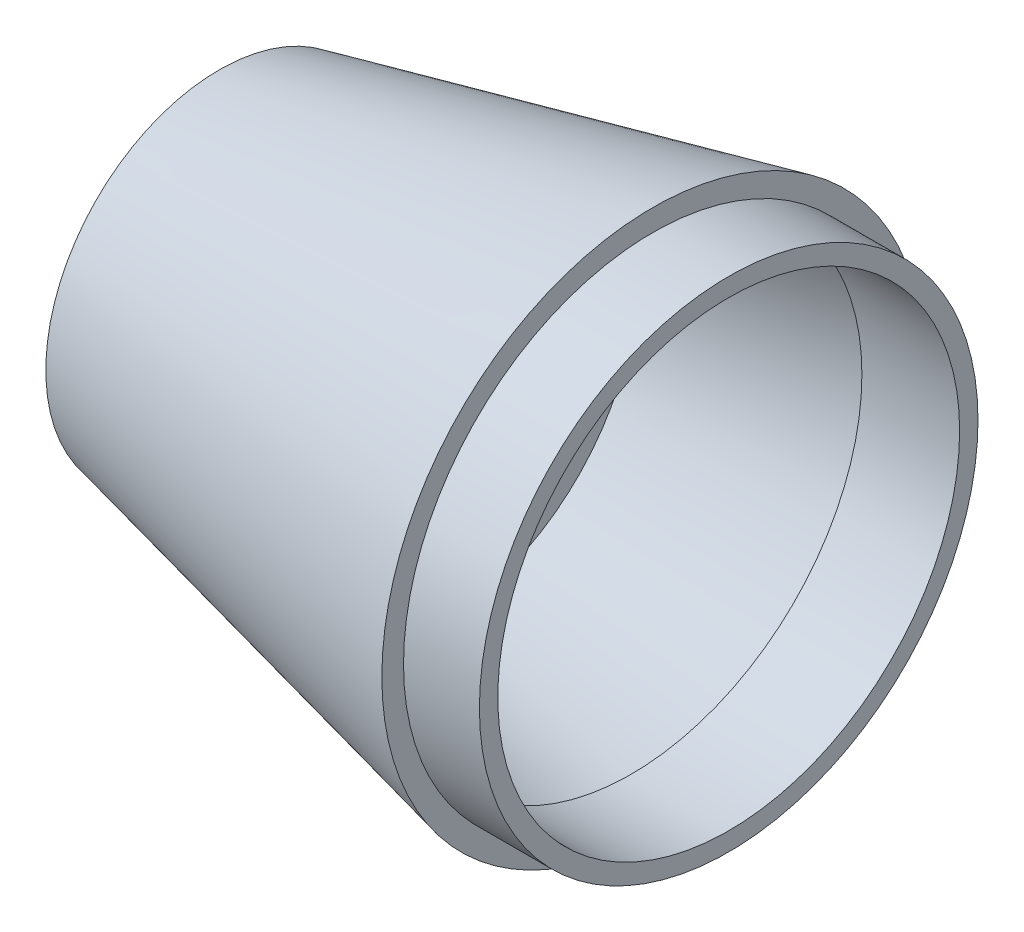
ISO-10303-21;
HEADER;
FILE_DESCRIPTION(('STEP AP214'),'2;1');
FILE_NAME('part.step','',(''),(''),'','','');
FILE_SCHEMA(('AUTOMOTIVE_DESIGN { 1 0 10303 214 1 1 1 1 }'));
ENDSEC;
DATA;
#1=APPLICATION_CONTEXT('core data for automotive mechanical design processes');
#2=APPLICATION_PROTOCOL_DEFINITION('international standard','automotive_design',2000,#1);
#3=PRODUCT_CONTEXT('',#1,'mechanical');
#4=PRODUCT('Part','Part','',(#3));
#5=PRODUCT_RELATED_PRODUCT_CATEGORY('part','',(#4));
#6=PRODUCT_DEFINITION_FORMATION('','',#4);
#7=PRODUCT_DEFINITION_CONTEXT('part definition',#1,'design');
#8=PRODUCT_DEFINITION('design','',#6,#7);
#9=PRODUCT_DEFINITION_SHAPE('','',#8);
#10=(LENGTH_UNIT() NAMED_UNIT(*) SI_UNIT(.MILLI.,.METRE.));
#11=(NAMED_UNIT(*) PLANE_ANGLE_UNIT() SI_UNIT($,.RADIAN.));
#12=(NAMED_UNIT(*) SI_UNIT($,.STERADIAN.) SOLID_ANGLE_UNIT());
#13=UNCERTAINTY_MEASURE_WITH_UNIT(LENGTH_MEASURE(1.E-05),#10,'distance_accuracy_value','');
#14=(GEOMETRIC_REPRESENTATION_CONTEXT(3) GLOBAL_UNCERTAINTY_ASSIGNED_CONTEXT((#13)) GLOBAL_UNIT_ASSIGNED_CONTEXT((#10,
#11,#12)) REPRESENTATION_CONTEXT('',''));
#15=CARTESIAN_POINT('',(0.,0.,0.));
#16=DIRECTION('',(0.,0.,1.));
#17=DIRECTION('',(1.,0.,0.));
#18=AXIS2_PLACEMENT_3D('',#15,#16,#17);
#19=CARTESIAN_POINT('',(-12.065,0.,0.));
#20=DIRECTION('',(-1.,0.,0.));
#21=DIRECTION('',(0.,0.,1.));
#22=AXIS2_PLACEMENT_3D('',#19,#20,#21);
#23=PLANE('',#22);
#24=CARTESIAN_POINT('',(-12.065,0.,0.));
#25=DIRECTION('',(1.,0.,0.));
#26=DIRECTION('',(0.,0.,-1.));
#27=AXIS2_PLACEMENT_3D('',#24,#25,#26);
#28=CIRCLE('',#27,8.88999999999999);
#29=CARTESIAN_POINT('',(-12.065,0.,-8.88999999999999));
#30=VERTEX_POINT('',#29);
#31=EDGE_CURVE('E10',#30,#30,#28,.T.);
#32=ORIENTED_EDGE('',*,*,#31,.T.);
#33=EDGE_LOOP('',(#32));
#34=FACE_BOUND('',#33,.T.);
#35=CARTESIAN_POINT('',(-12.065,0.,0.));
#36=DIRECTION('',(1.,0.,0.));
#37=DIRECTION('',(0.,0.,-1.));
#38=AXIS2_PLACEMENT_3D('',#35,#36,#37);
#39=CIRCLE('',#38,10.16);
#40=CARTESIAN_POINT('',(-12.065,0.,-10.16));
#41=VERTEX_POINT('',#40);
#42=EDGE_CURVE('E60',#41,#41,#39,.T.);
#43=ORIENTED_EDGE('',*,*,#42,.F.);
#44=EDGE_LOOP('',(#43));
#45=FACE_BOUND('',#44,.T.);
#46=ADVANCED_FACE('F45',(#34,#45),#23,.T.);
#47=CARTESIAN_POINT('',(-12.065,0.,0.));
#48=DIRECTION('',(1.,0.,0.));
#49=DIRECTION('',(0.,0.,-1.));
#50=AXIS2_PLACEMENT_3D('',#47,#48,#49);
#51=CONICAL_SURFACE('',#50,8.88999999999999,0.221314442347792);
#52=CARTESIAN_POINT('',(-0.848332369137096,0.,0.));
#53=DIRECTION('',(1.,0.,0.));
#54=DIRECTION('',(0.,0.,-1.));
#55=AXIS2_PLACEMENT_3D('',#52,#53,#54);
#56=CIRCLE('',#55,11.4137502169441);
#57=CARTESIAN_POINT('',(-0.848332369137096,0.,-11.4137502169441));
#58=VERTEX_POINT('',#57);
#59=EDGE_CURVE('E54',#58,#58,#56,.T.);
#60=ORIENTED_EDGE('',*,*,#59,.T.);
#61=EDGE_LOOP('',(#60));
#62=FACE_BOUND('',#61,.T.);
#63=ORIENTED_EDGE('',*,*,#31,.F.);
#64=EDGE_LOOP('',(#63));
#65=FACE_BOUND('',#64,.T.);
#66=ADVANCED_FACE('F110',(#62,#65),#51,.F.);
#67=CARTESIAN_POINT('',(-0.848332369137096,0.,0.));
#68=DIRECTION('',(1.,0.,0.));
#69=DIRECTION('',(0.,0.,-1.));
#70=AXIS2_PLACEMENT_3D('',#67,#68,#69);
#71=CONICAL_SURFACE('',#70,12.6837502169441,0.221314442347791);
#72=ORIENTED_EDGE('',*,*,#42,.T.);
#73=EDGE_LOOP('',(#72));
#74=FACE_BOUND('',#73,.T.);
#75=CARTESIAN_POINT('',(13.335,0.,0.));
#76=DIRECTION('',(1.,0.,0.));
#77=DIRECTION('',(0.,0.,-1.));
#78=AXIS2_PLACEMENT_3D('',#75,#76,#77);
#79=CIRCLE('',#78,15.875);
#80=CARTESIAN_POINT('',(13.335,0.,-15.875));
#81=VERTEX_POINT('',#80);
#82=EDGE_CURVE('E69',#81,#81,#79,.T.);
#83=ORIENTED_EDGE('',*,*,#82,.F.);
#84=EDGE_LOOP('',(#83));
#85=FACE_BOUND('',#84,.T.);
#86=ADVANCED_FACE('F107',(#74,#85),#71,.T.);
#87=CARTESIAN_POINT('',(0.635,0.,0.));
#88=DIRECTION('',(1.,0.,0.));
#89=DIRECTION('',(0.,0.,-1.));
#90=AXIS2_PLACEMENT_3D('',#87,#88,#89);
#91=PLANE('',#90);
#92=CARTESIAN_POINT('',(0.635000000000004,0.,0.));
#93=DIRECTION('',(1.,0.,0.));
#94=DIRECTION('',(0.,0.,-1.));
#95=AXIS2_PLACEMENT_3D('',#92,#93,#94);
#96=CIRCLE('',#95,11.7475);
#97=CARTESIAN_POINT('',(0.635000000000004,0.,-11.7475));
#98=VERTEX_POINT('',#97);
#99=EDGE_CURVE('E64',#98,#98,#96,.T.);
#100=ORIENTED_EDGE('',*,*,#99,.T.);
#101=EDGE_LOOP('',(#100));
#102=FACE_BOUND('',#101,.T.);
#103=ADVANCED_FACE('F109',(#102),#91,.T.);
#104=CARTESIAN_POINT('',(0.635000000000004,0.,0.));
#105=DIRECTION('',(1.,0.,0.));
#106=DIRECTION('',(0.,0.,-1.));
#107=AXIS2_PLACEMENT_3D('',#104,#105,#106);
#108=CONICAL_SURFACE('',#107,11.7475,0.221314442347791);
#109=ORIENTED_EDGE('',*,*,#99,.F.);
#110=EDGE_LOOP('',(#109));
#111=FACE_BOUND('',#110,.T.);
#112=CARTESIAN_POINT('',(12.0565737379203,0.,0.));
#113=DIRECTION('',(1.,0.,0.));
#114=DIRECTION('',(0.,0.,-1.));
#115=AXIS2_PLACEMENT_3D('',#112,#113,#114);
#116=CIRCLE('',#115,14.3173540910321);
#117=CARTESIAN_POINT('',(12.0565737379203,0.,-14.3173540910321));
#118=VERTEX_POINT('',#117);
#119=EDGE_CURVE('E68',#118,#118,#116,.T.);
#120=ORIENTED_EDGE('',*,*,#119,.T.);
#121=EDGE_LOOP('',(#120));
#122=FACE_BOUND('',#121,.T.);
#123=ADVANCED_FACE('F103',(#111,#122),#108,.F.);
#124=CARTESIAN_POINT('',(12.0565737379203,13.5286024515819,0.));
#125=DIRECTION('',(1.,0.,0.));
#126=DIRECTION('',(0.,0.,-1.));
#127=AXIS2_PLACEMENT_3D('',#124,#125,#126);
#128=PLANE('',#127);
#129=ORIENTED_EDGE('',*,*,#119,.F.);
#130=EDGE_LOOP('',(#129));
#131=FACE_BOUND('',#130,.T.);
#132=CARTESIAN_POINT('',(12.0565737379203,0.,0.));
#133=DIRECTION('',(1.,0.,0.));
#134=DIRECTION('',(0.,0.,-1.));
#135=AXIS2_PLACEMENT_3D('',#132,#133,#134);
#136=CIRCLE('',#135,13.5286024515819);
#137=CARTESIAN_POINT('',(12.0565737379203,0.,-13.5286024515819));
#138=VERTEX_POINT('',#137);
#139=EDGE_CURVE('E80',#138,#138,#136,.T.);
#140=ORIENTED_EDGE('',*,*,#139,.T.);
#141=EDGE_LOOP('',(#140));
#142=FACE_BOUND('',#141,.T.);
#143=ADVANCED_FACE('F104',(#131,#142),#128,.F.);
#144=CARTESIAN_POINT('',(44.7264408045133,0.,0.));
#145=DIRECTION('',(1.,0.,0.));
#146=DIRECTION('',(0.,0.,-1.));
#147=AXIS2_PLACEMENT_3D('',#144,#145,#146);
#148=CYLINDRICAL_SURFACE('',#147,13.5286024515819);
#149=ORIENTED_EDGE('',*,*,#139,.F.);
#150=EDGE_LOOP('',(#149));
#151=FACE_BOUND('',#150,.T.);
#152=CARTESIAN_POINT('',(17.7811500833164,0.,0.));
#153=DIRECTION('',(1.,0.,0.));
#154=DIRECTION('',(0.,0.,-1.));
#155=AXIS2_PLACEMENT_3D('',#152,#153,#154);
#156=CIRCLE('',#155,13.5286024515819);
#157=CARTESIAN_POINT('',(17.7811500833164,0.,-13.5286024515819));
#158=VERTEX_POINT('',#157);
#159=EDGE_CURVE('E83',#158,#158,#156,.T.);
#160=ORIENTED_EDGE('',*,*,#159,.T.);
#161=EDGE_LOOP('',(#160));
#162=FACE_BOUND('',#161,.T.);
#163=ADVANCED_FACE('F135',(#151,#162),#148,.F.);
#164=CARTESIAN_POINT('',(17.7811500833164,14.605,0.));
#165=DIRECTION('',(-1.,0.,0.));
#166=DIRECTION('',(0.,0.,1.));
#167=AXIS2_PLACEMENT_3D('',#164,#165,#166);
#168=PLANE('',#167);
#169=ORIENTED_EDGE('',*,*,#159,.F.);
#170=EDGE_LOOP('',(#169));
#171=FACE_BOUND('',#170,.T.);
#172=CARTESIAN_POINT('',(17.7811500833164,0.,0.));
#173=DIRECTION('',(1.,0.,0.));
#174=DIRECTION('',(0.,0.,-1.));
#175=AXIS2_PLACEMENT_3D('',#172,#173,#174);
#176=CIRCLE('',#175,14.605);
#177=CARTESIAN_POINT('',(17.7811500833164,0.,-14.605));
#178=VERTEX_POINT('',#177);
#179=EDGE_CURVE('E49',#178,#178,#176,.T.);
#180=ORIENTED_EDGE('',*,*,#179,.T.);
#181=EDGE_LOOP('',(#180));
#182=FACE_BOUND('',#181,.T.);
#183=ADVANCED_FACE('F92',(#171,#182),#168,.F.);
#184=CARTESIAN_POINT('',(44.7264408045133,0.,0.));
#185=DIRECTION('',(1.,0.,0.));
#186=DIRECTION('',(0.,0.,-1.));
#187=AXIS2_PLACEMENT_3D('',#184,#185,#186);
#188=CYLINDRICAL_SURFACE('',#187,14.605);
#189=ORIENTED_EDGE('',*,*,#179,.F.);
#190=EDGE_LOOP('',(#189));
#191=FACE_BOUND('',#190,.T.);
#192=CARTESIAN_POINT('',(13.335,0.,0.));
#193=DIRECTION('',(1.,0.,0.));
#194=DIRECTION('',(0.,0.,-1.));
#195=AXIS2_PLACEMENT_3D('',#192,#193,#194);
#196=CIRCLE('',#195,14.605);
#197=CARTESIAN_POINT('',(13.335,0.,-14.605));
#198=VERTEX_POINT('',#197);
#199=EDGE_CURVE('E73',#198,#198,#196,.T.);
#200=ORIENTED_EDGE('',*,*,#199,.T.);
#201=EDGE_LOOP('',(#200));
#202=FACE_BOUND('',#201,.T.);
#203=ADVANCED_FACE('F47',(#191,#202),#188,.T.);
#204=CARTESIAN_POINT('',(13.335,0.,0.));
#205=DIRECTION('',(-1.,0.,0.));
#206=DIRECTION('',(0.,0.,1.));
#207=AXIS2_PLACEMENT_3D('',#204,#205,#206);
#208=PLANE('',#207);
#209=ORIENTED_EDGE('',*,*,#199,.F.);
#210=EDGE_LOOP('',(#209));
#211=FACE_BOUND('',#210,.T.);
#212=ORIENTED_EDGE('',*,*,#82,.T.);
#213=EDGE_LOOP('',(#212));
#214=FACE_BOUND('',#213,.T.);
#215=ADVANCED_FACE('F96',(#211,#214),#208,.F.);
#216=CARTESIAN_POINT('',(-0.848332369137094,0.,0.));
#217=DIRECTION('',(-1.,0.,0.));
#218=DIRECTION('',(0.,0.,1.));
#219=AXIS2_PLACEMENT_3D('',#216,#217,#218);
#220=PLANE('',#219);
#221=ORIENTED_EDGE('',*,*,#59,.F.);
#222=EDGE_LOOP('',(#221));
#223=FACE_BOUND('',#222,.T.);
#224=ADVANCED_FACE('F101',(#223),#220,.T.);
#225=CLOSED_SHELL('',(#46,#66,#86,#103,#123,#143,#163,#183,#203,#215,#224));
#226=MANIFOLD_SOLID_BREP('B2',#225);
#227=ADVANCED_BREP_SHAPE_REPRESENTATION('',(#18,#226),#14);
#228=SHAPE_DEFINITION_REPRESENTATION(#9,#227);
ENDSEC;
END-ISO-10303-21;
